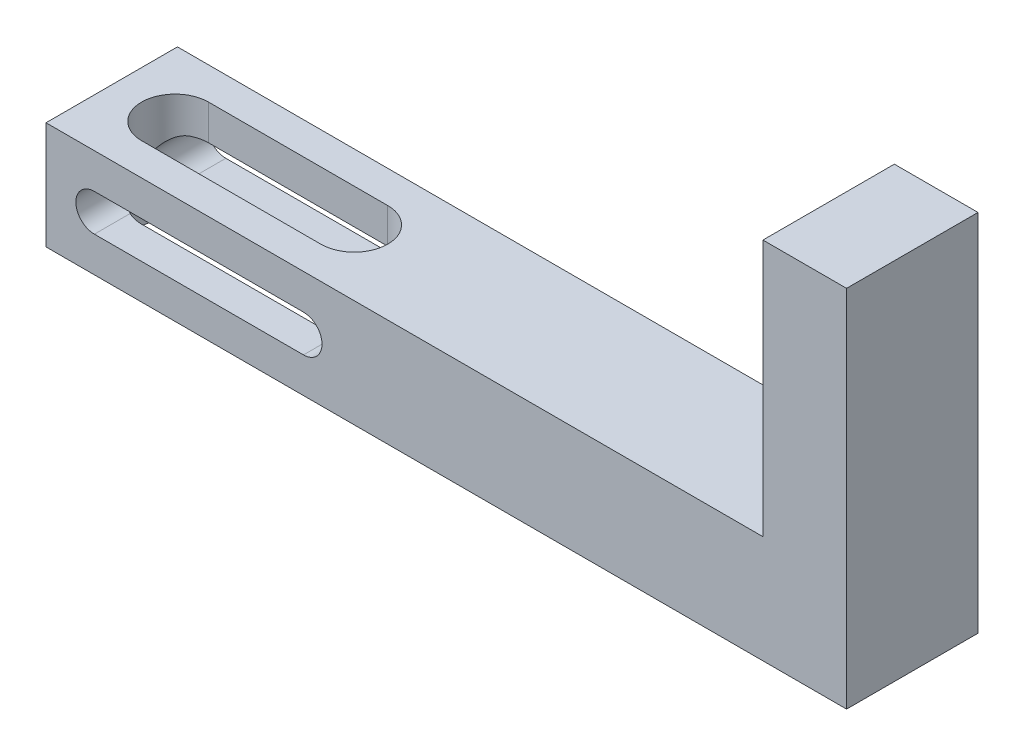
ISO-10303-21;
HEADER;
FILE_DESCRIPTION(('STEP AP214'),'2;1');
FILE_NAME('part.step','',(''),(''),'','','');
FILE_SCHEMA(('AUTOMOTIVE_DESIGN { 1 0 10303 214 1 1 1 1 }'));
ENDSEC;
DATA;
#1=APPLICATION_CONTEXT('core data for automotive mechanical design processes');
#2=APPLICATION_PROTOCOL_DEFINITION('international standard','automotive_design',2000,#1);
#3=PRODUCT_CONTEXT('',#1,'mechanical');
#4=PRODUCT('Part','Part','',(#3));
#5=PRODUCT_RELATED_PRODUCT_CATEGORY('part','',(#4));
#6=PRODUCT_DEFINITION_FORMATION('','',#4);
#7=PRODUCT_DEFINITION_CONTEXT('part definition',#1,'design');
#8=PRODUCT_DEFINITION('design','',#6,#7);
#9=PRODUCT_DEFINITION_SHAPE('','',#8);
#10=(LENGTH_UNIT() NAMED_UNIT(*) SI_UNIT(.MILLI.,.METRE.));
#11=(NAMED_UNIT(*) PLANE_ANGLE_UNIT() SI_UNIT($,.RADIAN.));
#12=(NAMED_UNIT(*) SI_UNIT($,.STERADIAN.) SOLID_ANGLE_UNIT());
#13=UNCERTAINTY_MEASURE_WITH_UNIT(LENGTH_MEASURE(1.E-05),#10,'distance_accuracy_value','');
#14=(GEOMETRIC_REPRESENTATION_CONTEXT(3) GLOBAL_UNCERTAINTY_ASSIGNED_CONTEXT((#13)) GLOBAL_UNIT_ASSIGNED_CONTEXT((#10,
#11,#12)) REPRESENTATION_CONTEXT('',''));
#15=CARTESIAN_POINT('',(0.,0.,0.));
#16=DIRECTION('',(0.,0.,1.));
#17=DIRECTION('',(1.,0.,0.));
#18=AXIS2_PLACEMENT_3D('',#15,#16,#17);
#19=CARTESIAN_POINT('',(5.3,30.5,-5.5));
#20=DIRECTION('',(0.,-1.,0.));
#21=DIRECTION('',(0.,0.,-1.));
#22=AXIS2_PLACEMENT_3D('',#19,#20,#21);
#23=CYLINDRICAL_SURFACE('',#22,2.8);
#24=DIRECTION('',(0.,-1.,0.));
#25=VECTOR('',#24,1.);
#26=CARTESIAN_POINT('',(5.3,30.5,-2.7));
#27=LINE('',#26,#25);
#28=CARTESIAN_POINT('',(5.3,9.00000000000001,-2.7));
#29=VERTEX_POINT('',#28);
#30=CARTESIAN_POINT('',(5.3,6.05,-2.7));
#31=VERTEX_POINT('',#30);
#32=EDGE_CURVE('E280',#29,#31,#27,.T.);
#33=ORIENTED_EDGE('',*,*,#32,.T.);
#34=CARTESIAN_POINT('',(5.3,6.05,-5.5));
#35=DIRECTION('',(0.,1.,0.));
#36=DIRECTION('',(0.,0.,1.));
#37=AXIS2_PLACEMENT_3D('',#34,#35,#36);
#38=CIRCLE('',#37,2.8);
#39=CARTESIAN_POINT('',(4.05,6.05,-2.99450603672649));
#40=VERTEX_POINT('',#39);
#41=EDGE_CURVE('E264',#31,#40,#38,.F.);
#42=ORIENTED_EDGE('',*,*,#41,.T.);
#43=CARTESIAN_POINT('',(4.05,6.05,-2.99450603672649));
#44=CARTESIAN_POINT('',(4.00235849913731,6.05000340639754,-3.01826171536032));
#45=CARTESIAN_POINT('',(3.95543816924829,6.04780450688059,-3.04337946868175));
#46=CARTESIAN_POINT('',(3.8634397763347,6.03942247074209,-3.09602795578411));
#47=CARTESIAN_POINT('',(3.81835871592903,6.03324611635234,-3.12355451323439));
#48=CARTESIAN_POINT('',(3.73072489964936,6.01740812684859,-3.18049942577392));
#49=CARTESIAN_POINT('',(3.6881510048414,6.00778277508583,-3.20989555889612));
#50=CARTESIAN_POINT('',(3.605208038342,5.98543127808409,-3.27057729910489));
#51=CARTESIAN_POINT('',(3.56484017622652,5.97270345222116,-3.30186392334678));
#52=CARTESIAN_POINT('',(3.42475933375882,5.92234509184322,-3.41662665287988));
#53=CARTESIAN_POINT('',(3.33154010018353,5.87702653045519,-3.50481057967421));
#54=CARTESIAN_POINT('',(3.160795126384,5.7735233259298,-3.68899824075137));
#55=CARTESIAN_POINT('',(3.08335403082285,5.71527261948903,-3.78504046793833));
#56=CARTESIAN_POINT('',(2.91569641114651,5.56451907068572,-4.02221169885626));
#57=CARTESIAN_POINT('',(2.83296675232883,5.46768800440536,-4.16587457247137));
#58=CARTESIAN_POINT('',(2.69569649998511,5.26385100249981,-4.4589320450385));
#59=CARTESIAN_POINT('',(2.64116094654124,5.15684325169811,-4.60832766367309));
#60=CARTESIAN_POINT('',(2.56661244256878,4.95921054483475,-4.88009361695275));
#61=CARTESIAN_POINT('',(2.54188977334829,4.86956176589482,-5.00192732743831));
#62=CARTESIAN_POINT('',(2.508790461093,4.68869356353422,-5.24637444852197));
#63=CARTESIAN_POINT('',(2.50038422886213,4.59747728645986,-5.36898604242123));
#64=CARTESIAN_POINT('',(2.50000429530611,4.50421148485537,-5.49433958240073));
#65=CARTESIAN_POINT('',(2.50000000449027,4.5021057217412,-5.4971698183893));
#66=CARTESIAN_POINT('',(2.5,4.5,-5.5));
#67=B_SPLINE_CURVE_WITH_KNOTS('',3,(#43,#44,#45,#46,#47,#48,#49,#50,#51,#52,#53,#54,#55,#56,#57,
#58,#59,#60,#61,#62,#63,#64,#65,#66),.UNSPECIFIED.,.F.,.F.,(4,2,2,2,2,2,2,2,2,2,2,4),(0.,
0.159584782014913,0.318898163000891,0.476582537575669,0.634352521045717,1.04020194633436,
1.44817439937518,2.02103744606059,2.59400286447553,3.05297573278237,3.51111549190942,
3.52169850498702),.UNSPECIFIED.);
#68=CARTESIAN_POINT('',(2.5,4.5,-5.5));
#69=VERTEX_POINT('',#68);
#70=EDGE_CURVE('E11',#40,#69,#67,.T.);
#71=ORIENTED_EDGE('',*,*,#70,.T.);
#72=CARTESIAN_POINT('',(4.05,6.05,-8.00549396327351));
#73=CARTESIAN_POINT('',(4.00235849913731,6.05000340639754,-7.98173828463968));
#74=CARTESIAN_POINT('',(3.95543816924829,6.04780450688059,-7.95662053131825));
#75=CARTESIAN_POINT('',(3.8634397763347,6.03942247074209,-7.90397204421589));
#76=CARTESIAN_POINT('',(3.81835871592903,6.03324611635234,-7.87644548676561));
#77=CARTESIAN_POINT('',(3.73072489964936,6.01740812684859,-7.81950057422607));
#78=CARTESIAN_POINT('',(3.6881510048414,6.00778277508583,-7.79010444110388));
#79=CARTESIAN_POINT('',(3.605208038342,5.98543127808409,-7.72942270089511));
#80=CARTESIAN_POINT('',(3.56484017622652,5.97270345222116,-7.69813607665322));
#81=CARTESIAN_POINT('',(3.42475933375882,5.92234509184322,-7.58337334712012));
#82=CARTESIAN_POINT('',(3.33154010018353,5.87702653045519,-7.49518942032579));
#83=CARTESIAN_POINT('',(3.160795126384,5.7735233259298,-7.31100175924863));
#84=CARTESIAN_POINT('',(3.08335403082285,5.71527261948903,-7.21495953206167));
#85=CARTESIAN_POINT('',(2.91569641114651,5.56451907068572,-6.97778830114374));
#86=CARTESIAN_POINT('',(2.83296675232883,5.46768800440536,-6.83412542752863));
#87=CARTESIAN_POINT('',(2.69569649998511,5.26385100249981,-6.5410679549615));
#88=CARTESIAN_POINT('',(2.64116094654124,5.15684325169811,-6.39167233632691));
#89=CARTESIAN_POINT('',(2.56661244256878,4.95921054483476,-6.11990638304725));
#90=CARTESIAN_POINT('',(2.54188977334829,4.86956176589482,-5.99807267256169));
#91=CARTESIAN_POINT('',(2.50879046109301,4.68869356353422,-5.75362555147803));
#92=CARTESIAN_POINT('',(2.50038422886213,4.59747728645986,-5.63101395757877));
#93=CARTESIAN_POINT('',(2.50000429530611,4.50421148485537,-5.50566041759927));
#94=CARTESIAN_POINT('',(2.50000000449027,4.5021057217412,-5.5028301816107));
#95=CARTESIAN_POINT('',(2.5,4.5,-5.5));
#96=B_SPLINE_CURVE_WITH_KNOTS('',3,(#72,#73,#74,#75,#76,#77,#78,#79,#80,#81,#82,#83,#84,#85,#86,
#87,#88,#89,#90,#91,#92,#93,#94,#95),.UNSPECIFIED.,.F.,.F.,(4,2,2,2,2,2,2,2,2,2,2,4),(0.,
0.159584782014911,0.318898163000891,0.476582537575669,0.634352521045716,1.04020194633436,
1.44817439937518,2.02103744606059,2.59400286447552,3.05297573278237,3.51111549190942,
3.52169850498702),.UNSPECIFIED.);
#97=CARTESIAN_POINT('',(4.05,6.05,-8.00549396327351));
#98=VERTEX_POINT('',#97);
#99=EDGE_CURVE('E61',#69,#98,#96,.F.);
#100=ORIENTED_EDGE('',*,*,#99,.T.);
#101=CARTESIAN_POINT('',(5.3,6.05,-8.3));
#102=VERTEX_POINT('',#101);
#103=EDGE_CURVE('E260',#98,#102,#38,.F.);
#104=ORIENTED_EDGE('',*,*,#103,.T.);
#105=DIRECTION('',(0.,-1.,0.));
#106=VECTOR('',#105,1.);
#107=CARTESIAN_POINT('',(5.3,30.5,-8.3));
#108=LINE('',#107,#106);
#109=CARTESIAN_POINT('',(5.3,9.00000000000001,-8.3));
#110=VERTEX_POINT('',#109);
#111=EDGE_CURVE('E293',#110,#102,#108,.T.);
#112=ORIENTED_EDGE('',*,*,#111,.F.);
#113=CARTESIAN_POINT('',(5.3,9.,-5.5));
#114=DIRECTION('',(0.,1.,0.));
#115=DIRECTION('',(-1.,0.,0.));
#116=AXIS2_PLACEMENT_3D('',#113,#114,#115);
#117=CIRCLE('',#116,2.8);
#118=EDGE_CURVE('E303',#110,#29,#117,.T.);
#119=ORIENTED_EDGE('',*,*,#118,.T.);
#120=EDGE_LOOP('',(#33,#42,#71,#100,#104,#112,#119));
#121=FACE_BOUND('',#120,.T.);
#122=ADVANCED_FACE('F40',(#121),#23,.F.);
#123=CARTESIAN_POINT('',(5.3,30.5,-2.7));
#124=DIRECTION('',(0.,0.,-1.));
#125=DIRECTION('',(-1.,0.,0.));
#126=AXIS2_PLACEMENT_3D('',#123,#124,#125);
#127=PLANE('',#126);
#128=DIRECTION('',(1.,0.,0.));
#129=VECTOR('',#128,1.);
#130=CARTESIAN_POINT('',(5.3,6.05,-2.7));
#131=LINE('',#130,#129);
#132=CARTESIAN_POINT('',(20.3,6.05,-2.7));
#133=VERTEX_POINT('',#132);
#134=EDGE_CURVE('E265',#31,#133,#131,.T.);
#135=ORIENTED_EDGE('',*,*,#134,.F.);
#136=ORIENTED_EDGE('',*,*,#32,.F.);
#137=DIRECTION('',(-1.,0.,0.));
#138=VECTOR('',#137,1.);
#139=CARTESIAN_POINT('',(60.,9.00000000000001,-2.7));
#140=LINE('',#139,#138);
#141=CARTESIAN_POINT('',(20.3,9.00000000000001,-2.7));
#142=VERTEX_POINT('',#141);
#143=EDGE_CURVE('E300',#142,#29,#140,.T.);
#144=ORIENTED_EDGE('',*,*,#143,.F.);
#145=DIRECTION('',(0.,-1.,0.));
#146=VECTOR('',#145,1.);
#147=CARTESIAN_POINT('',(20.3,30.5,-2.7));
#148=LINE('',#147,#146);
#149=EDGE_CURVE('E285',#142,#133,#148,.T.);
#150=ORIENTED_EDGE('',*,*,#149,.T.);
#151=EDGE_LOOP('',(#135,#136,#144,#150));
#152=FACE_BOUND('',#151,.T.);
#153=ADVANCED_FACE('F482',(#152),#127,.T.);
#154=CARTESIAN_POINT('',(20.3,30.5,-5.5));
#155=DIRECTION('',(0.,-1.,0.));
#156=DIRECTION('',(0.,0.,-1.));
#157=AXIS2_PLACEMENT_3D('',#154,#155,#156);
#158=CYLINDRICAL_SURFACE('',#157,2.8);
#159=CARTESIAN_POINT('',(21.55,2.95,-2.99450603672649));
#160=CARTESIAN_POINT('',(21.5976415008627,2.94999659360246,-3.01826171536031));
#161=CARTESIAN_POINT('',(21.6445618307517,2.95219549311941,-3.04337946868173));
#162=CARTESIAN_POINT('',(21.7365602236652,2.9605775292579,-3.09602795578407));
#163=CARTESIAN_POINT('',(21.7816412840709,2.96675388364764,-3.12355451323434));
#164=CARTESIAN_POINT('',(21.8692751003506,2.98259187315139,-3.18049942577387));
#165=CARTESIAN_POINT('',(21.9118489951585,2.99221722491415,-3.20989555889607));
#166=CARTESIAN_POINT('',(21.994791961658,3.0145687219159,-3.27057729910487));
#167=CARTESIAN_POINT('',(22.0351598237735,3.02729654777883,-3.30186392334677));
#168=CARTESIAN_POINT('',(22.1752406662412,3.07765490815679,-3.4166266528799));
#169=CARTESIAN_POINT('',(22.2684598998165,3.12297346954485,-3.50481057967425));
#170=CARTESIAN_POINT('',(22.439204873616,3.22647667407021,-3.68899824075143));
#171=CARTESIAN_POINT('',(22.5166459691772,3.28472738051093,-3.7850404679384));
#172=CARTESIAN_POINT('',(22.6843035888535,3.43548092931433,-4.02221169885617));
#173=CARTESIAN_POINT('',(22.7670332476711,3.53231199559491,-4.16587457247106));
#174=CARTESIAN_POINT('',(22.9043035000149,3.7361489974998,-4.45893204503868));
#175=CARTESIAN_POINT('',(22.9588390534587,3.84315674830062,-4.60832766367398));
#176=CARTESIAN_POINT('',(23.0333875574312,4.04078945516624,-4.88009361695203));
#177=CARTESIAN_POINT('',(23.0581102266517,4.13043823410854,-5.00192732743584));
#178=CARTESIAN_POINT('',(23.091209538907,4.31130643646241,-5.24637444852451));
#179=CARTESIAN_POINT('',(23.0996157711379,4.40252271352768,-5.36898604243051));
#180=CARTESIAN_POINT('',(23.0999957046939,4.49578851514405,-5.49433958240115));
#181=CARTESIAN_POINT('',(23.0999999955097,4.4978942782585,-5.49716981838952));
#182=CARTESIAN_POINT('',(23.1,4.5,-5.5));
#183=B_SPLINE_CURVE_WITH_KNOTS('',3,(#159,#160,#161,#162,#163,#164,#165,#166,#167,#168,#169,
#170,#171,#172,#173,#174,#175,#176,#177,#178,#179,#180,#181,#182),.UNSPECIFIED.,.F.,.F.,(4,2,2,
2,2,2,2,2,2,2,2,4),(0.,0.159584782014847,0.318898163000757,0.476582537575603,0.634352521045716,
1.04020194633446,1.44817439937518,2.02103744606044,2.59400286447553,3.05297573278241,
3.51111549190941,3.52169850498701),.UNSPECIFIED.);
#184=CARTESIAN_POINT('',(21.55,2.95,-2.99450603672649));
#185=VERTEX_POINT('',#184);
#186=CARTESIAN_POINT('',(23.1,4.5,-5.5));
#187=VERTEX_POINT('',#186);
#188=EDGE_CURVE('E359',#185,#187,#183,.T.);
#189=ORIENTED_EDGE('',*,*,#188,.T.);
#190=CARTESIAN_POINT('',(21.55,2.95,-8.00549396327351));
#191=CARTESIAN_POINT('',(21.5976415008627,2.94999659360246,-7.98173828463968));
#192=CARTESIAN_POINT('',(21.6445618307517,2.95219549311941,-7.95662053131827));
#193=CARTESIAN_POINT('',(21.7365602236652,2.9605775292579,-7.90397204421592));
#194=CARTESIAN_POINT('',(21.7816412840709,2.96675388364764,-7.87644548676566));
#195=CARTESIAN_POINT('',(21.8692751003506,2.98259187315139,-7.81950057422613));
#196=CARTESIAN_POINT('',(21.9118489951585,2.99221722491415,-7.79010444110392));
#197=CARTESIAN_POINT('',(21.994791961658,3.0145687219159,-7.72942270089513));
#198=CARTESIAN_POINT('',(22.0351598237735,3.02729654777883,-7.69813607665323));
#199=CARTESIAN_POINT('',(22.1752406662412,3.07765490815679,-7.5833733471201));
#200=CARTESIAN_POINT('',(22.2684598998165,3.12297346954485,-7.49518942032575));
#201=CARTESIAN_POINT('',(22.439204873616,3.22647667407022,-7.31100175924856));
#202=CARTESIAN_POINT('',(22.5166459691772,3.28472738051094,-7.2149595320616));
#203=CARTESIAN_POINT('',(22.6843035888535,3.43548092931433,-6.97778830114381));
#204=CARTESIAN_POINT('',(22.7670332476711,3.53231199559491,-6.83412542752892));
#205=CARTESIAN_POINT('',(22.9043035000149,3.73614899749982,-6.54106795496132));
#206=CARTESIAN_POINT('',(22.9588390534588,3.84315674830068,-6.39167233632604));
#207=CARTESIAN_POINT('',(23.0333875574312,4.0407894551662,-6.11990638304792));
#208=CARTESIAN_POINT('',(23.0581102266517,4.13043823410842,-5.99807267256405));
#209=CARTESIAN_POINT('',(23.091209538907,4.31130643646255,-5.75362555147559));
#210=CARTESIAN_POINT('',(23.0996157711379,4.40252271352818,-5.63101395756986));
#211=CARTESIAN_POINT('',(23.0999957046939,4.49578851514408,-5.50566041759886));
#212=CARTESIAN_POINT('',(23.0999999955097,4.49789427825852,-5.50283018161049));
#213=CARTESIAN_POINT('',(23.1,4.5,-5.5));
#214=B_SPLINE_CURVE_WITH_KNOTS('',3,(#190,#191,#192,#193,#194,#195,#196,#197,#198,#199,#200,
#201,#202,#203,#204,#205,#206,#207,#208,#209,#210,#211,#212,#213),.UNSPECIFIED.,.F.,.F.,(4,2,2,
2,2,2,2,2,2,2,2,4),(0.,0.159584782014851,0.318898163000768,0.476582537575606,0.634352521045719,
1.04020194633446,1.44817439937519,2.02103744606046,2.59400286447555,3.05297573278241,
3.51111549190941,3.52169850498701),.UNSPECIFIED.);
#215=CARTESIAN_POINT('',(21.55,2.95,-8.00549396327351));
#216=VERTEX_POINT('',#215);
#217=EDGE_CURVE('E391',#187,#216,#214,.F.);
#218=ORIENTED_EDGE('',*,*,#217,.T.);
#219=CARTESIAN_POINT('',(20.3,2.95,-5.5));
#220=DIRECTION('',(0.,-1.,0.));
#221=DIRECTION('',(0.,0.,-1.));
#222=AXIS2_PLACEMENT_3D('',#219,#220,#221);
#223=CIRCLE('',#222,2.8);
#224=CARTESIAN_POINT('',(20.3,2.95,-8.3));
#225=VERTEX_POINT('',#224);
#226=EDGE_CURVE('E242',#216,#225,#223,.F.);
#227=ORIENTED_EDGE('',*,*,#226,.T.);
#228=DIRECTION('',(0.,-1.,0.));
#229=VECTOR('',#228,1.);
#230=CARTESIAN_POINT('',(20.3,30.5,-8.3));
#231=LINE('',#230,#229);
#232=CARTESIAN_POINT('',(20.3,0.,-8.3));
#233=VERTEX_POINT('',#232);
#234=EDGE_CURVE('E292',#225,#233,#231,.T.);
#235=ORIENTED_EDGE('',*,*,#234,.T.);
#236=CARTESIAN_POINT('',(20.3,0.,-5.5));
#237=DIRECTION('',(0.,-1.,0.));
#238=DIRECTION('',(0.,0.,-1.));
#239=AXIS2_PLACEMENT_3D('',#236,#237,#238);
#240=CIRCLE('',#239,2.8);
#241=CARTESIAN_POINT('',(20.3,0.,-2.7));
#242=VERTEX_POINT('',#241);
#243=EDGE_CURVE('E273',#233,#242,#240,.T.);
#244=ORIENTED_EDGE('',*,*,#243,.T.);
#245=CARTESIAN_POINT('',(20.3,2.95,-2.7));
#246=VERTEX_POINT('',#245);
#247=EDGE_CURVE('E288',#246,#242,#148,.T.);
#248=ORIENTED_EDGE('',*,*,#247,.F.);
#249=EDGE_CURVE('E252',#246,#185,#223,.F.);
#250=ORIENTED_EDGE('',*,*,#249,.T.);
#251=EDGE_LOOP('',(#189,#218,#227,#235,#244,#248,#250));
#252=FACE_BOUND('',#251,.T.);
#253=ADVANCED_FACE('F465',(#252),#158,.F.);
#254=CARTESIAN_POINT('',(5.3,30.5,-8.3));
#255=DIRECTION('',(0.,0.,-1.));
#256=DIRECTION('',(-1.,0.,0.));
#257=AXIS2_PLACEMENT_3D('',#254,#255,#256);
#258=PLANE('',#257);
#259=ORIENTED_EDGE('',*,*,#111,.T.);
#260=DIRECTION('',(1.,0.,0.));
#261=VECTOR('',#260,1.);
#262=CARTESIAN_POINT('',(5.3,6.05,-8.3));
#263=LINE('',#262,#261);
#264=CARTESIAN_POINT('',(20.3,6.05000000000001,-8.3));
#265=VERTEX_POINT('',#264);
#266=EDGE_CURVE('E356',#102,#265,#263,.T.);
#267=ORIENTED_EDGE('',*,*,#266,.T.);
#268=CARTESIAN_POINT('',(20.3,9.,-8.3));
#269=VERTEX_POINT('',#268);
#270=EDGE_CURVE('E289',#269,#265,#231,.T.);
#271=ORIENTED_EDGE('',*,*,#270,.F.);
#272=DIRECTION('',(-1.,0.,0.));
#273=VECTOR('',#272,1.);
#274=CARTESIAN_POINT('',(60.,9.00000000000001,-8.3));
#275=LINE('',#274,#273);
#276=EDGE_CURVE('E283',#269,#110,#275,.T.);
#277=ORIENTED_EDGE('',*,*,#276,.T.);
#278=EDGE_LOOP('',(#259,#267,#271,#277));
#279=FACE_BOUND('',#278,.T.);
#280=ADVANCED_FACE('F475',(#279),#258,.F.);
#281=CARTESIAN_POINT('',(0.,9.,-11.));
#282=DIRECTION('',(-1.,0.,0.));
#283=DIRECTION('',(0.,-1.,0.));
#284=AXIS2_PLACEMENT_3D('',#281,#282,#283);
#285=PLANE('',#284);
#286=DIRECTION('',(0.,-1.,0.));
#287=VECTOR('',#286,1.);
#288=CARTESIAN_POINT('',(0.,9.,0.));
#289=LINE('',#288,#287);
#290=CARTESIAN_POINT('',(0.,9.,0.));
#291=VERTEX_POINT('',#290);
#292=CARTESIAN_POINT('',(0.,0.,0.));
#293=VERTEX_POINT('',#292);
#294=EDGE_CURVE('E305',#291,#293,#289,.T.);
#295=ORIENTED_EDGE('',*,*,#294,.F.);
#296=DIRECTION('',(0.,0.,1.));
#297=VECTOR('',#296,1.);
#298=CARTESIAN_POINT('',(0.,9.,-11.));
#299=LINE('',#298,#297);
#300=CARTESIAN_POINT('',(0.,9.,-11.));
#301=VERTEX_POINT('',#300);
#302=EDGE_CURVE('E342',#301,#291,#299,.T.);
#303=ORIENTED_EDGE('',*,*,#302,.F.);
#304=DIRECTION('',(0.,-1.,0.));
#305=VECTOR('',#304,1.);
#306=CARTESIAN_POINT('',(0.,9.,-11.));
#307=LINE('',#306,#305);
#308=CARTESIAN_POINT('',(0.,0.,-11.));
#309=VERTEX_POINT('',#308);
#310=EDGE_CURVE('E306',#301,#309,#307,.T.);
#311=ORIENTED_EDGE('',*,*,#310,.T.);
#312=DIRECTION('',(0.,0.,1.));
#313=VECTOR('',#312,1.);
#314=CARTESIAN_POINT('',(0.,0.,-11.));
#315=LINE('',#314,#313);
#316=EDGE_CURVE('E325',#309,#293,#315,.T.);
#317=ORIENTED_EDGE('',*,*,#316,.T.);
#318=EDGE_LOOP('',(#295,#303,#311,#317));
#319=FACE_BOUND('',#318,.T.);
#320=ADVANCED_FACE('F42',(#319),#285,.T.);
#321=CARTESIAN_POINT('',(60.,9.00000000000001,-11.));
#322=DIRECTION('',(0.,1.,0.));
#323=DIRECTION('',(-1.,0.,0.));
#324=AXIS2_PLACEMENT_3D('',#321,#322,#323);
#325=PLANE('',#324);
#326=ORIENTED_EDGE('',*,*,#118,.F.);
#327=ORIENTED_EDGE('',*,*,#276,.F.);
#328=CARTESIAN_POINT('',(20.3,9.00000000000001,-5.5));
#329=DIRECTION('',(0.,1.,0.));
#330=DIRECTION('',(-1.,0.,0.));
#331=AXIS2_PLACEMENT_3D('',#328,#329,#330);
#332=CIRCLE('',#331,2.8);
#333=EDGE_CURVE('E297',#142,#269,#332,.T.);
#334=ORIENTED_EDGE('',*,*,#333,.F.);
#335=ORIENTED_EDGE('',*,*,#143,.T.);
#336=EDGE_LOOP('',(#326,#327,#334,#335));
#337=FACE_BOUND('',#336,.T.);
#338=DIRECTION('',(-1.,0.,0.));
#339=VECTOR('',#338,1.);
#340=CARTESIAN_POINT('',(60.,9.00000000000001,0.));
#341=LINE('',#340,#339);
#342=CARTESIAN_POINT('',(60.,9.00000000000001,0.));
#343=VERTEX_POINT('',#342);
#344=EDGE_CURVE('E310',#343,#291,#341,.T.);
#345=ORIENTED_EDGE('',*,*,#344,.F.);
#346=DIRECTION('',(0.,0.,1.));
#347=VECTOR('',#346,1.);
#348=CARTESIAN_POINT('',(60.,9.00000000000001,-11.));
#349=LINE('',#348,#347);
#350=CARTESIAN_POINT('',(60.,9.00000000000001,-11.));
#351=VERTEX_POINT('',#350);
#352=EDGE_CURVE('E345',#351,#343,#349,.T.);
#353=ORIENTED_EDGE('',*,*,#352,.F.);
#354=DIRECTION('',(-1.,0.,0.));
#355=VECTOR('',#354,1.);
#356=CARTESIAN_POINT('',(60.,9.00000000000001,-11.));
#357=LINE('',#356,#355);
#358=EDGE_CURVE('E322',#351,#301,#357,.T.);
#359=ORIENTED_EDGE('',*,*,#358,.T.);
#360=ORIENTED_EDGE('',*,*,#302,.T.);
#361=EDGE_LOOP('',(#345,#353,#359,#360));
#362=FACE_BOUND('',#361,.T.);
#363=ADVANCED_FACE('F479',(#337,#362),#325,.T.);
#364=CARTESIAN_POINT('',(60.,30.5,-11.));
#365=DIRECTION('',(-1.,0.,0.));
#366=DIRECTION('',(0.,-1.,0.));
#367=AXIS2_PLACEMENT_3D('',#364,#365,#366);
#368=PLANE('',#367);
#369=DIRECTION('',(0.,-1.,0.));
#370=VECTOR('',#369,1.);
#371=CARTESIAN_POINT('',(60.,30.5,0.));
#372=LINE('',#371,#370);
#373=CARTESIAN_POINT('',(60.,30.5,0.));
#374=VERTEX_POINT('',#373);
#375=EDGE_CURVE('E337',#374,#343,#372,.T.);
#376=ORIENTED_EDGE('',*,*,#375,.F.);
#377=DIRECTION('',(0.,0.,1.));
#378=VECTOR('',#377,1.);
#379=CARTESIAN_POINT('',(60.,30.5,-11.));
#380=LINE('',#379,#378);
#381=CARTESIAN_POINT('',(60.,30.5,-11.));
#382=VERTEX_POINT('',#381);
#383=EDGE_CURVE('E347',#382,#374,#380,.T.);
#384=ORIENTED_EDGE('',*,*,#383,.F.);
#385=DIRECTION('',(0.,-1.,0.));
#386=VECTOR('',#385,1.);
#387=CARTESIAN_POINT('',(60.,30.5,-11.));
#388=LINE('',#387,#386);
#389=EDGE_CURVE('E319',#382,#351,#388,.T.);
#390=ORIENTED_EDGE('',*,*,#389,.T.);
#391=ORIENTED_EDGE('',*,*,#352,.T.);
#392=EDGE_LOOP('',(#376,#384,#390,#391));
#393=FACE_BOUND('',#392,.T.);
#394=ADVANCED_FACE('F506',(#393),#368,.T.);
#395=CARTESIAN_POINT('',(67.,30.5,-11.));
#396=DIRECTION('',(0.,1.,0.));
#397=DIRECTION('',(-1.,0.,0.));
#398=AXIS2_PLACEMENT_3D('',#395,#396,#397);
#399=PLANE('',#398);
#400=DIRECTION('',(-1.,0.,0.));
#401=VECTOR('',#400,1.);
#402=CARTESIAN_POINT('',(67.,30.5,0.));
#403=LINE('',#402,#401);
#404=CARTESIAN_POINT('',(67.,30.5,0.));
#405=VERTEX_POINT('',#404);
#406=EDGE_CURVE('E334',#405,#374,#403,.T.);
#407=ORIENTED_EDGE('',*,*,#406,.F.);
#408=DIRECTION('',(0.,0.,1.));
#409=VECTOR('',#408,1.);
#410=CARTESIAN_POINT('',(67.,30.5,-11.));
#411=LINE('',#410,#409);
#412=CARTESIAN_POINT('',(67.,30.5,-11.));
#413=VERTEX_POINT('',#412);
#414=EDGE_CURVE('E349',#413,#405,#411,.T.);
#415=ORIENTED_EDGE('',*,*,#414,.F.);
#416=DIRECTION('',(-1.,0.,0.));
#417=VECTOR('',#416,1.);
#418=CARTESIAN_POINT('',(67.,30.5,-11.));
#419=LINE('',#418,#417);
#420=EDGE_CURVE('E316',#413,#382,#419,.T.);
#421=ORIENTED_EDGE('',*,*,#420,.T.);
#422=ORIENTED_EDGE('',*,*,#383,.T.);
#423=EDGE_LOOP('',(#407,#415,#421,#422));
#424=FACE_BOUND('',#423,.T.);
#425=ADVANCED_FACE('F509',(#424),#399,.T.);
#426=CARTESIAN_POINT('',(67.,0.,-11.));
#427=DIRECTION('',(1.,0.,0.));
#428=DIRECTION('',(0.,0.,-1.));
#429=AXIS2_PLACEMENT_3D('',#426,#427,#428);
#430=PLANE('',#429);
#431=DIRECTION('',(0.,1.,0.));
#432=VECTOR('',#431,1.);
#433=CARTESIAN_POINT('',(67.,0.,0.));
#434=LINE('',#433,#432);
#435=CARTESIAN_POINT('',(67.,0.,0.));
#436=VERTEX_POINT('',#435);
#437=EDGE_CURVE('E331',#436,#405,#434,.T.);
#438=ORIENTED_EDGE('',*,*,#437,.F.);
#439=DIRECTION('',(0.,0.,1.));
#440=VECTOR('',#439,1.);
#441=CARTESIAN_POINT('',(67.,0.,-11.));
#442=LINE('',#441,#440);
#443=CARTESIAN_POINT('',(67.,0.,-11.));
#444=VERTEX_POINT('',#443);
#445=EDGE_CURVE('E351',#444,#436,#442,.T.);
#446=ORIENTED_EDGE('',*,*,#445,.F.);
#447=DIRECTION('',(0.,1.,0.));
#448=VECTOR('',#447,1.);
#449=CARTESIAN_POINT('',(67.,0.,-11.));
#450=LINE('',#449,#448);
#451=EDGE_CURVE('E313',#444,#413,#450,.T.);
#452=ORIENTED_EDGE('',*,*,#451,.T.);
#453=ORIENTED_EDGE('',*,*,#414,.T.);
#454=EDGE_LOOP('',(#438,#446,#452,#453));
#455=FACE_BOUND('',#454,.T.);
#456=ADVANCED_FACE('F513',(#455),#430,.T.);
#457=CARTESIAN_POINT('',(0.,0.,-11.));
#458=DIRECTION('',(0.,-1.,0.));
#459=DIRECTION('',(0.,0.,-1.));
#460=AXIS2_PLACEMENT_3D('',#457,#458,#459);
#461=PLANE('',#460);
#462=CARTESIAN_POINT('',(5.3,0.,-5.5));
#463=DIRECTION('',(0.,-1.,0.));
#464=DIRECTION('',(0.,0.,-1.));
#465=AXIS2_PLACEMENT_3D('',#462,#463,#464);
#466=CIRCLE('',#465,2.8);
#467=CARTESIAN_POINT('',(5.3,0.,-2.7));
#468=VERTEX_POINT('',#467);
#469=CARTESIAN_POINT('',(5.3,0.,-8.3));
#470=VERTEX_POINT('',#469);
#471=EDGE_CURVE('E267',#468,#470,#466,.T.);
#472=ORIENTED_EDGE('',*,*,#471,.F.);
#473=DIRECTION('',(1.,0.,0.));
#474=VECTOR('',#473,1.);
#475=CARTESIAN_POINT('',(5.3,0.,-2.7));
#476=LINE('',#475,#474);
#477=EDGE_CURVE('E276',#468,#242,#476,.T.);
#478=ORIENTED_EDGE('',*,*,#477,.T.);
#479=ORIENTED_EDGE('',*,*,#243,.F.);
#480=DIRECTION('',(1.,0.,0.));
#481=VECTOR('',#480,1.);
#482=CARTESIAN_POINT('',(5.3,0.,-8.3));
#483=LINE('',#482,#481);
#484=EDGE_CURVE('E270',#470,#233,#483,.T.);
#485=ORIENTED_EDGE('',*,*,#484,.F.);
#486=EDGE_LOOP('',(#472,#478,#479,#485));
#487=FACE_BOUND('',#486,.T.);
#488=DIRECTION('',(1.,0.,0.));
#489=VECTOR('',#488,1.);
#490=CARTESIAN_POINT('',(0.,0.,0.));
#491=LINE('',#490,#489);
#492=EDGE_CURVE('E328',#293,#436,#491,.T.);
#493=ORIENTED_EDGE('',*,*,#492,.F.);
#494=ORIENTED_EDGE('',*,*,#316,.F.);
#495=DIRECTION('',(1.,0.,0.));
#496=VECTOR('',#495,1.);
#497=CARTESIAN_POINT('',(0.,0.,-11.));
#498=LINE('',#497,#496);
#499=EDGE_CURVE('E309',#309,#444,#498,.T.);
#500=ORIENTED_EDGE('',*,*,#499,.T.);
#501=ORIENTED_EDGE('',*,*,#445,.T.);
#502=EDGE_LOOP('',(#493,#494,#500,#501));
#503=FACE_BOUND('',#502,.T.);
#504=ADVANCED_FACE('F458',(#487,#503),#461,.T.);
#505=CARTESIAN_POINT('',(0.,0.,-11.));
#506=DIRECTION('',(0.,0.,1.));
#507=DIRECTION('',(1.,0.,0.));
#508=AXIS2_PLACEMENT_3D('',#505,#506,#507);
#509=PLANE('',#508);
#510=DIRECTION('',(-1.,0.,0.));
#511=VECTOR('',#510,1.);
#512=CARTESIAN_POINT('',(4.05,6.05,-11.));
#513=LINE('',#512,#511);
#514=CARTESIAN_POINT('',(21.55,6.05,-11.));
#515=VERTEX_POINT('',#514);
#516=CARTESIAN_POINT('',(4.05,6.05,-11.));
#517=VERTEX_POINT('',#516);
#518=EDGE_CURVE('E224',#515,#517,#513,.T.);
#519=ORIENTED_EDGE('',*,*,#518,.T.);
#520=CARTESIAN_POINT('',(4.05,4.5,-11.));
#521=DIRECTION('',(0.,0.,1.));
#522=DIRECTION('',(1.,0.,0.));
#523=AXIS2_PLACEMENT_3D('',#520,#521,#522);
#524=CIRCLE('',#523,1.55);
#525=CARTESIAN_POINT('',(4.05,2.95,-11.));
#526=VERTEX_POINT('',#525);
#527=EDGE_CURVE('E206',#517,#526,#524,.T.);
#528=ORIENTED_EDGE('',*,*,#527,.T.);
#529=DIRECTION('',(1.,0.,0.));
#530=VECTOR('',#529,1.);
#531=CARTESIAN_POINT('',(4.05,2.95,-11.));
#532=LINE('',#531,#530);
#533=CARTESIAN_POINT('',(21.55,2.95,-11.));
#534=VERTEX_POINT('',#533);
#535=EDGE_CURVE('E216',#526,#534,#532,.T.);
#536=ORIENTED_EDGE('',*,*,#535,.T.);
#537=CARTESIAN_POINT('',(21.55,4.5,-11.));
#538=DIRECTION('',(0.,0.,1.));
#539=DIRECTION('',(1.,0.,0.));
#540=AXIS2_PLACEMENT_3D('',#537,#538,#539);
#541=CIRCLE('',#540,1.55);
#542=EDGE_CURVE('E69',#534,#515,#541,.T.);
#543=ORIENTED_EDGE('',*,*,#542,.T.);
#544=EDGE_LOOP('',(#519,#528,#536,#543));
#545=FACE_BOUND('',#544,.T.);
#546=ORIENTED_EDGE('',*,*,#310,.F.);
#547=ORIENTED_EDGE('',*,*,#358,.F.);
#548=ORIENTED_EDGE('',*,*,#389,.F.);
#549=ORIENTED_EDGE('',*,*,#420,.F.);
#550=ORIENTED_EDGE('',*,*,#451,.F.);
#551=ORIENTED_EDGE('',*,*,#499,.F.);
#552=EDGE_LOOP('',(#546,#547,#548,#549,#550,#551));
#553=FACE_BOUND('',#552,.T.);
#554=ADVANCED_FACE('F221',(#545,#553),#509,.F.);
#555=CARTESIAN_POINT('',(0.,0.,0.));
#556=DIRECTION('',(0.,0.,1.));
#557=DIRECTION('',(1.,0.,0.));
#558=AXIS2_PLACEMENT_3D('',#555,#556,#557);
#559=PLANE('',#558);
#560=CARTESIAN_POINT('',(4.05,4.5,0.));
#561=DIRECTION('',(0.,0.,1.));
#562=DIRECTION('',(1.,0.,0.));
#563=AXIS2_PLACEMENT_3D('',#560,#561,#562);
#564=CIRCLE('',#563,1.55);
#565=CARTESIAN_POINT('',(4.05,6.05,0.));
#566=VERTEX_POINT('',#565);
#567=CARTESIAN_POINT('',(4.05,2.95,0.));
#568=VERTEX_POINT('',#567);
#569=EDGE_CURVE('E233',#566,#568,#564,.T.);
#570=ORIENTED_EDGE('',*,*,#569,.F.);
#571=DIRECTION('',(-1.,0.,0.));
#572=VECTOR('',#571,1.);
#573=CARTESIAN_POINT('',(4.05,6.05,0.));
#574=LINE('',#573,#572);
#575=CARTESIAN_POINT('',(21.55,6.05,0.));
#576=VERTEX_POINT('',#575);
#577=EDGE_CURVE('E225',#576,#566,#574,.T.);
#578=ORIENTED_EDGE('',*,*,#577,.F.);
#579=CARTESIAN_POINT('',(21.55,4.5,0.));
#580=DIRECTION('',(0.,0.,1.));
#581=DIRECTION('',(1.,0.,0.));
#582=AXIS2_PLACEMENT_3D('',#579,#580,#581);
#583=CIRCLE('',#582,1.55);
#584=CARTESIAN_POINT('',(21.55,2.95,0.));
#585=VERTEX_POINT('',#584);
#586=EDGE_CURVE('E228',#585,#576,#583,.T.);
#587=ORIENTED_EDGE('',*,*,#586,.F.);
#588=DIRECTION('',(1.,0.,0.));
#589=VECTOR('',#588,1.);
#590=CARTESIAN_POINT('',(4.05,2.95,0.));
#591=LINE('',#590,#589);
#592=EDGE_CURVE('E235',#568,#585,#591,.T.);
#593=ORIENTED_EDGE('',*,*,#592,.F.);
#594=EDGE_LOOP('',(#570,#578,#587,#593));
#595=FACE_BOUND('',#594,.T.);
#596=ORIENTED_EDGE('',*,*,#294,.T.);
#597=ORIENTED_EDGE('',*,*,#492,.T.);
#598=ORIENTED_EDGE('',*,*,#437,.T.);
#599=ORIENTED_EDGE('',*,*,#406,.T.);
#600=ORIENTED_EDGE('',*,*,#375,.T.);
#601=ORIENTED_EDGE('',*,*,#344,.T.);
#602=EDGE_LOOP('',(#596,#597,#598,#599,#600,#601));
#603=FACE_BOUND('',#602,.T.);
#604=ADVANCED_FACE('F444',(#595,#603),#559,.T.);
#605=CARTESIAN_POINT('',(4.05,2.95,-8.00549396327351));
#606=CARTESIAN_POINT('',(4.00235849913731,2.94999659360246,-7.98173828463968));
#607=CARTESIAN_POINT('',(3.95543816924829,2.95219549311941,-7.95662053131825));
#608=CARTESIAN_POINT('',(3.8634397763347,2.96057752925791,-7.90397204421588));
#609=CARTESIAN_POINT('',(3.81835871592903,2.96675388364766,-7.87644548676561));
#610=CARTESIAN_POINT('',(3.73072489964936,2.98259187315141,-7.81950057422607));
#611=CARTESIAN_POINT('',(3.68815100484139,2.99221722491417,-7.79010444110388));
#612=CARTESIAN_POINT('',(3.60520803834199,3.01456872191591,-7.72942270089511));
#613=CARTESIAN_POINT('',(3.56484017622651,3.02729654777884,-7.69813607665322));
#614=CARTESIAN_POINT('',(3.42475933375882,3.07765490815678,-7.58337334712012));
#615=CARTESIAN_POINT('',(3.33154010018353,3.12297346954481,-7.49518942032579));
#616=CARTESIAN_POINT('',(3.16079512638399,3.2264766740702,-7.31100175924863));
#617=CARTESIAN_POINT('',(3.08335403082285,3.28472738051097,-7.21495953206167));
#618=CARTESIAN_POINT('',(2.91569641114651,3.43548092931428,-6.97778830114373));
#619=CARTESIAN_POINT('',(2.83296675232883,3.53231199559463,-6.83412542752861));
#620=CARTESIAN_POINT('',(2.69569649998511,3.7361489975002,-6.5410679549615));
#621=CARTESIAN_POINT('',(2.64116094654124,3.84315674830192,-6.39167233632692));
#622=CARTESIAN_POINT('',(2.56661244256878,4.04078945516523,-6.11990638304723));
#623=CARTESIAN_POINT('',(2.54188977334829,4.1304382341051,-5.99807267256164));
#624=CARTESIAN_POINT('',(2.50879046109301,4.31130643646585,-5.75362555147808));
#625=CARTESIAN_POINT('',(2.50038422886213,4.4025227135404,-5.63101395757896));
#626=CARTESIAN_POINT('',(2.50000429530611,4.49578851514463,-5.50566041759928));
#627=CARTESIAN_POINT('',(2.50000000449027,4.4978942782588,-5.5028301816107));
#628=CARTESIAN_POINT('',(2.5,4.5,-5.5));
#629=B_SPLINE_CURVE_WITH_KNOTS('',3,(#605,#606,#607,#608,#609,#610,#611,#612,#613,#614,#615,
#616,#617,#618,#619,#620,#621,#622,#623,#624,#625,#626,#627,#628),.UNSPECIFIED.,.F.,.F.,(4,2,2,
2,2,2,2,2,2,2,2,4),(0.,0.159584782014914,0.318898163000894,0.47658253757567,0.634352521045717,
1.04020194633436,1.44817439937519,2.0210374460606,2.59400286447553,3.05297573278237,
3.51111549190942,3.52169850498702),.UNSPECIFIED.);
#630=CARTESIAN_POINT('',(4.05,2.95,-8.00549396327351));
#631=VERTEX_POINT('',#630);
#632=EDGE_CURVE('E209',#631,#69,#629,.T.);
#633=ORIENTED_EDGE('',*,*,#632,.T.);
#634=CARTESIAN_POINT('',(4.05,2.95,-2.99450603672649));
#635=CARTESIAN_POINT('',(4.00235849913731,2.94999659360246,-3.01826171536032));
#636=CARTESIAN_POINT('',(3.95543816924829,2.95219549311941,-3.04337946868175));
#637=CARTESIAN_POINT('',(3.8634397763347,2.96057752925791,-3.09602795578412));
#638=CARTESIAN_POINT('',(3.81835871592903,2.96675388364766,-3.12355451323439));
#639=CARTESIAN_POINT('',(3.73072489964935,2.98259187315141,-3.18049942577393));
#640=CARTESIAN_POINT('',(3.68815100484139,2.99221722491417,-3.20989555889612));
#641=CARTESIAN_POINT('',(3.60520803834199,3.01456872191591,-3.27057729910489));
#642=CARTESIAN_POINT('',(3.56484017622651,3.02729654777884,-3.30186392334678));
#643=CARTESIAN_POINT('',(3.42475933375882,3.07765490815678,-3.41662665287988));
#644=CARTESIAN_POINT('',(3.33154010018353,3.12297346954481,-3.50481057967421));
#645=CARTESIAN_POINT('',(3.160795126384,3.2264766740702,-3.68899824075137));
#646=CARTESIAN_POINT('',(3.08335403082285,3.28472738051097,-3.78504046793833));
#647=CARTESIAN_POINT('',(2.91569641114651,3.43548092931428,-4.02221169885627));
#648=CARTESIAN_POINT('',(2.83296675232883,3.53231199559463,-4.16587457247139));
#649=CARTESIAN_POINT('',(2.69569649998511,3.7361489975002,-4.4589320450385));
#650=CARTESIAN_POINT('',(2.64116094654124,3.84315674830192,-4.60832766367307));
#651=CARTESIAN_POINT('',(2.56661244256878,4.04078945516522,-4.88009361695277));
#652=CARTESIAN_POINT('',(2.54188977334829,4.1304382341051,-5.00192732743837));
#653=CARTESIAN_POINT('',(2.50879046109301,4.31130643646586,-5.24637444852191));
#654=CARTESIAN_POINT('',(2.50038422886213,4.40252271354043,-5.36898604242101));
#655=CARTESIAN_POINT('',(2.50000429530611,4.49578851514464,-5.49433958240072));
#656=CARTESIAN_POINT('',(2.50000000449027,4.4978942782588,-5.49716981838929));
#657=CARTESIAN_POINT('',(2.5,4.5,-5.5));
#658=B_SPLINE_CURVE_WITH_KNOTS('',3,(#634,#635,#636,#637,#638,#639,#640,#641,#642,#643,#644,
#645,#646,#647,#648,#649,#650,#651,#652,#653,#654,#655,#656,#657),.UNSPECIFIED.,.F.,.F.,(4,2,2,
2,2,2,2,2,2,2,2,4),(0.,0.159584782014915,0.318898163000896,0.476582537575671,0.634352521045718,
1.04020194633436,1.44817439937519,2.0210374460606,2.59400286447553,3.05297573278237,
3.51111549190942,3.52169850498702),.UNSPECIFIED.);
#659=CARTESIAN_POINT('',(4.05,2.95,-2.99450603672649));
#660=VERTEX_POINT('',#659);
#661=EDGE_CURVE('E54',#69,#660,#658,.F.);
#662=ORIENTED_EDGE('',*,*,#661,.T.);
#663=CARTESIAN_POINT('',(5.3,2.95,-5.5));
#664=DIRECTION('',(0.,-1.,0.));
#665=DIRECTION('',(0.,0.,-1.));
#666=AXIS2_PLACEMENT_3D('',#663,#664,#665);
#667=CIRCLE('',#666,2.8);
#668=CARTESIAN_POINT('',(5.3,2.95,-2.7));
#669=VERTEX_POINT('',#668);
#670=EDGE_CURVE('E254',#660,#669,#667,.F.);
#671=ORIENTED_EDGE('',*,*,#670,.T.);
#672=EDGE_CURVE('E284',#669,#468,#27,.T.);
#673=ORIENTED_EDGE('',*,*,#672,.T.);
#674=ORIENTED_EDGE('',*,*,#471,.T.);
#675=CARTESIAN_POINT('',(5.3,2.95000000000001,-8.3));
#676=VERTEX_POINT('',#675);
#677=EDGE_CURVE('E279',#676,#470,#108,.T.);
#678=ORIENTED_EDGE('',*,*,#677,.F.);
#679=EDGE_CURVE('E251',#676,#631,#667,.F.);
#680=ORIENTED_EDGE('',*,*,#679,.T.);
#681=EDGE_LOOP('',(#633,#662,#671,#673,#674,#678,#680));
#682=FACE_BOUND('',#681,.T.);
#683=ADVANCED_FACE('F413',(#682),#23,.F.);
#684=DIRECTION('',(-1.,0.,0.));
#685=VECTOR('',#684,1.);
#686=CARTESIAN_POINT('',(5.3,2.95,-2.7));
#687=LINE('',#686,#685);
#688=EDGE_CURVE('E255',#246,#669,#687,.T.);
#689=ORIENTED_EDGE('',*,*,#688,.F.);
#690=ORIENTED_EDGE('',*,*,#247,.T.);
#691=ORIENTED_EDGE('',*,*,#477,.F.);
#692=ORIENTED_EDGE('',*,*,#672,.F.);
#693=EDGE_LOOP('',(#689,#690,#691,#692));
#694=FACE_BOUND('',#693,.T.);
#695=ADVANCED_FACE('F419',(#694),#127,.T.);
#696=CARTESIAN_POINT('',(21.55,6.05,-2.99450603672649));
#697=CARTESIAN_POINT('',(21.5976415008627,6.05000340639754,-3.01826171536031));
#698=CARTESIAN_POINT('',(21.6445618307517,6.04780450688059,-3.04337946868173));
#699=CARTESIAN_POINT('',(21.7365602236652,6.0394224707421,-3.09602795578407));
#700=CARTESIAN_POINT('',(21.7816412840709,6.03324611635236,-3.12355451323434));
#701=CARTESIAN_POINT('',(21.8692751003506,6.01740812684861,-3.18049942577387));
#702=CARTESIAN_POINT('',(21.9118489951585,6.00778277508585,-3.20989555889608));
#703=CARTESIAN_POINT('',(21.994791961658,5.9854312780841,-3.27057729910487));
#704=CARTESIAN_POINT('',(22.0351598237735,5.97270345222117,-3.30186392334677));
#705=CARTESIAN_POINT('',(22.1752406662412,5.92234509184321,-3.4166266528799));
#706=CARTESIAN_POINT('',(22.2684598998165,5.87702653045515,-3.50481057967425));
#707=CARTESIAN_POINT('',(22.439204873616,5.77352332592979,-3.68899824075143));
#708=CARTESIAN_POINT('',(22.5166459691772,5.71527261948906,-3.7850404679384));
#709=CARTESIAN_POINT('',(22.6843035888535,5.56451907068567,-4.02221169885618));
#710=CARTESIAN_POINT('',(22.7670332476711,5.46768800440509,-4.16587457247107));
#711=CARTESIAN_POINT('',(22.9043035000149,5.26385100250019,-4.45893204503868));
#712=CARTESIAN_POINT('',(22.9588390534587,5.15684325169935,-4.60832766367397));
#713=CARTESIAN_POINT('',(23.0333875574312,4.95921054483378,-4.88009361695205));
#714=CARTESIAN_POINT('',(23.0581102266517,4.86956176589151,-5.00192732743588));
#715=CARTESIAN_POINT('',(23.091209538907,4.68869356353753,-5.24637444852447));
#716=CARTESIAN_POINT('',(23.0996157711379,4.59747728647211,-5.36898604243036));
#717=CARTESIAN_POINT('',(23.0999957046939,4.50421148485593,-5.49433958240115));
#718=CARTESIAN_POINT('',(23.0999999955097,4.50210572174148,-5.49716981838951));
#719=CARTESIAN_POINT('',(23.1,4.5,-5.5));
#720=B_SPLINE_CURVE_WITH_KNOTS('',3,(#696,#697,#698,#699,#700,#701,#702,#703,#704,#705,#706,
#707,#708,#709,#710,#711,#712,#713,#714,#715,#716,#717,#718,#719),.UNSPECIFIED.,.F.,.F.,(4,2,2,
2,2,2,2,2,2,2,2,4),(0.,0.159584782014843,0.318898163000757,0.476582537575603,0.634352521045716,
1.04020194633446,1.44817439937519,2.02103744606045,2.59400286447554,3.05297573278241,
3.51111549190942,3.52169850498702),.UNSPECIFIED.);
#721=CARTESIAN_POINT('',(21.55,6.05,-2.99450603672649));
#722=VERTEX_POINT('',#721);
#723=EDGE_CURVE('E397',#187,#722,#720,.F.);
#724=ORIENTED_EDGE('',*,*,#723,.T.);
#725=CARTESIAN_POINT('',(20.3,6.05,-5.5));
#726=DIRECTION('',(0.,1.,0.));
#727=DIRECTION('',(0.,0.,1.));
#728=AXIS2_PLACEMENT_3D('',#725,#726,#727);
#729=CIRCLE('',#728,2.8);
#730=EDGE_CURVE('E261',#722,#133,#729,.F.);
#731=ORIENTED_EDGE('',*,*,#730,.T.);
#732=ORIENTED_EDGE('',*,*,#149,.F.);
#733=ORIENTED_EDGE('',*,*,#333,.T.);
#734=ORIENTED_EDGE('',*,*,#270,.T.);
#735=CARTESIAN_POINT('',(21.55,6.05,-8.00549396327351));
#736=VERTEX_POINT('',#735);
#737=EDGE_CURVE('E257',#265,#736,#729,.F.);
#738=ORIENTED_EDGE('',*,*,#737,.T.);
#739=CARTESIAN_POINT('',(21.55,6.05,-8.00549396327351));
#740=CARTESIAN_POINT('',(21.5976415008627,6.05000340639754,-7.98173828463969));
#741=CARTESIAN_POINT('',(21.6445618307517,6.04780450688059,-7.95662053131827));
#742=CARTESIAN_POINT('',(21.7365602236652,6.0394224707421,-7.90397204421593));
#743=CARTESIAN_POINT('',(21.7816412840709,6.03324611635236,-7.87644548676566));
#744=CARTESIAN_POINT('',(21.8692751003506,6.01740812684861,-7.81950057422613));
#745=CARTESIAN_POINT('',(21.9118489951585,6.00778277508585,-7.79010444110392));
#746=CARTESIAN_POINT('',(21.994791961658,5.9854312780841,-7.72942270089513));
#747=CARTESIAN_POINT('',(22.0351598237735,5.97270345222117,-7.69813607665323));
#748=CARTESIAN_POINT('',(22.1752406662412,5.92234509184321,-7.5833733471201));
#749=CARTESIAN_POINT('',(22.2684598998165,5.87702653045515,-7.49518942032575));
#750=CARTESIAN_POINT('',(22.439204873616,5.77352332592978,-7.31100175924857));
#751=CARTESIAN_POINT('',(22.5166459691772,5.71527261948906,-7.2149595320616));
#752=CARTESIAN_POINT('',(22.6843035888535,5.56451907068567,-6.97778830114382));
#753=CARTESIAN_POINT('',(22.7670332476711,5.46768800440509,-6.83412542752893));
#754=CARTESIAN_POINT('',(22.9043035000149,5.26385100250019,-6.54106795496132));
#755=CARTESIAN_POINT('',(22.9588390534587,5.15684325169936,-6.39167233632603));
#756=CARTESIAN_POINT('',(23.0333875574312,4.95921054483378,-6.11990638304795));
#757=CARTESIAN_POINT('',(23.0581102266517,4.86956176589151,-5.99807267256412));
#758=CARTESIAN_POINT('',(23.091209538907,4.68869356353753,-5.75362555147553));
#759=CARTESIAN_POINT('',(23.0996157711379,4.5974772864721,-5.63101395756964));
#760=CARTESIAN_POINT('',(23.0999957046939,4.50421148485593,-5.50566041759885));
#761=CARTESIAN_POINT('',(23.0999999955097,4.50210572174148,-5.50283018161049));
#762=CARTESIAN_POINT('',(23.1,4.5,-5.5));
#763=B_SPLINE_CURVE_WITH_KNOTS('',3,(#739,#740,#741,#742,#743,#744,#745,#746,#747,#748,#749,
#750,#751,#752,#753,#754,#755,#756,#757,#758,#759,#760,#761,#762),.UNSPECIFIED.,.F.,.F.,(4,2,2,
2,2,2,2,2,2,2,2,4),(0.,0.159584782014846,0.31889816300076,0.476582537575603,0.634352521045719,
1.04020194633446,1.44817439937519,2.02103744606045,2.59400286447554,3.05297573278241,
3.51111549190942,3.52169850498702),.UNSPECIFIED.);
#764=EDGE_CURVE('E368',#736,#187,#763,.T.);
#765=ORIENTED_EDGE('',*,*,#764,.T.);
#766=EDGE_LOOP('',(#724,#731,#732,#733,#734,#738,#765));
#767=FACE_BOUND('',#766,.T.);
#768=ADVANCED_FACE('F374',(#767),#158,.F.);
#769=ORIENTED_EDGE('',*,*,#234,.F.);
#770=DIRECTION('',(-1.,0.,0.));
#771=VECTOR('',#770,1.);
#772=CARTESIAN_POINT('',(5.3,2.95,-8.3));
#773=LINE('',#772,#771);
#774=EDGE_CURVE('E344',#225,#676,#773,.T.);
#775=ORIENTED_EDGE('',*,*,#774,.T.);
#776=ORIENTED_EDGE('',*,*,#677,.T.);
#777=ORIENTED_EDGE('',*,*,#484,.T.);
#778=EDGE_LOOP('',(#769,#775,#776,#777));
#779=FACE_BOUND('',#778,.T.);
#780=ADVANCED_FACE('F463',(#779),#258,.F.);
#781=CARTESIAN_POINT('',(4.05,2.95,-11.));
#782=DIRECTION('',(0.,-1.,0.));
#783=DIRECTION('',(0.,0.,-1.));
#784=AXIS2_PLACEMENT_3D('',#781,#782,#783);
#785=PLANE('',#784);
#786=ORIENTED_EDGE('',*,*,#774,.F.);
#787=ORIENTED_EDGE('',*,*,#226,.F.);
#788=DIRECTION('',(0.,0.,1.));
#789=VECTOR('',#788,1.);
#790=CARTESIAN_POINT('',(21.55,2.95,-11.));
#791=LINE('',#790,#789);
#792=EDGE_CURVE('E218',#534,#216,#791,.T.);
#793=ORIENTED_EDGE('',*,*,#792,.F.);
#794=ORIENTED_EDGE('',*,*,#535,.F.);
#795=DIRECTION('',(0.,0.,1.));
#796=VECTOR('',#795,1.);
#797=CARTESIAN_POINT('',(4.05,2.95,-11.));
#798=LINE('',#797,#796);
#799=EDGE_CURVE('E202',#526,#631,#798,.T.);
#800=ORIENTED_EDGE('',*,*,#799,.T.);
#801=ORIENTED_EDGE('',*,*,#679,.F.);
#802=EDGE_LOOP('',(#786,#787,#793,#794,#800,#801));
#803=FACE_BOUND('',#802,.T.);
#804=ADVANCED_FACE('F217',(#803),#785,.F.);
#805=CARTESIAN_POINT('',(4.05,6.05,-11.));
#806=DIRECTION('',(0.,1.,0.));
#807=DIRECTION('',(0.,0.,1.));
#808=AXIS2_PLACEMENT_3D('',#805,#806,#807);
#809=PLANE('',#808);
#810=DIRECTION('',(0.,0.,1.));
#811=VECTOR('',#810,1.);
#812=CARTESIAN_POINT('',(4.05,6.05,-11.));
#813=LINE('',#812,#811);
#814=EDGE_CURVE('E240',#517,#98,#813,.T.);
#815=ORIENTED_EDGE('',*,*,#814,.F.);
#816=ORIENTED_EDGE('',*,*,#518,.F.);
#817=DIRECTION('',(0.,0.,1.));
#818=VECTOR('',#817,1.);
#819=CARTESIAN_POINT('',(21.55,6.05,-11.));
#820=LINE('',#819,#818);
#821=EDGE_CURVE('E244',#515,#736,#820,.T.);
#822=ORIENTED_EDGE('',*,*,#821,.T.);
#823=ORIENTED_EDGE('',*,*,#737,.F.);
#824=ORIENTED_EDGE('',*,*,#266,.F.);
#825=ORIENTED_EDGE('',*,*,#103,.F.);
#826=EDGE_LOOP('',(#815,#816,#822,#823,#824,#825));
#827=FACE_BOUND('',#826,.T.);
#828=ADVANCED_FACE('F383',(#827),#809,.F.);
#829=CARTESIAN_POINT('',(21.55,4.5,-11.));
#830=DIRECTION('',(0.,0.,1.));
#831=DIRECTION('',(1.,0.,0.));
#832=AXIS2_PLACEMENT_3D('',#829,#830,#831);
#833=CYLINDRICAL_SURFACE('',#832,1.55);
#834=ORIENTED_EDGE('',*,*,#821,.F.);
#835=ORIENTED_EDGE('',*,*,#542,.F.);
#836=ORIENTED_EDGE('',*,*,#792,.T.);
#837=ORIENTED_EDGE('',*,*,#217,.F.);
#838=ORIENTED_EDGE('',*,*,#764,.F.);
#839=EDGE_LOOP('',(#834,#835,#836,#837,#838));
#840=FACE_BOUND('',#839,.T.);
#841=ADVANCED_FACE('F378',(#840),#833,.F.);
#842=CARTESIAN_POINT('',(4.05,4.5,-11.));
#843=DIRECTION('',(0.,0.,1.));
#844=DIRECTION('',(1.,0.,0.));
#845=AXIS2_PLACEMENT_3D('',#842,#843,#844);
#846=CYLINDRICAL_SURFACE('',#845,1.55);
#847=ORIENTED_EDGE('',*,*,#799,.F.);
#848=ORIENTED_EDGE('',*,*,#527,.F.);
#849=ORIENTED_EDGE('',*,*,#814,.T.);
#850=ORIENTED_EDGE('',*,*,#99,.F.);
#851=ORIENTED_EDGE('',*,*,#632,.F.);
#852=EDGE_LOOP('',(#847,#848,#849,#850,#851));
#853=FACE_BOUND('',#852,.T.);
#854=ADVANCED_FACE('F204',(#853),#846,.F.);
#855=EDGE_CURVE('E243',#40,#566,#813,.T.);
#856=ORIENTED_EDGE('',*,*,#855,.T.);
#857=ORIENTED_EDGE('',*,*,#569,.T.);
#858=EDGE_CURVE('E213',#660,#568,#798,.T.);
#859=ORIENTED_EDGE('',*,*,#858,.F.);
#860=ORIENTED_EDGE('',*,*,#661,.F.);
#861=ORIENTED_EDGE('',*,*,#70,.F.);
#862=EDGE_LOOP('',(#856,#857,#859,#860,#861));
#863=FACE_BOUND('',#862,.T.);
#864=ADVANCED_FACE('F418',(#863),#846,.F.);
#865=EDGE_CURVE('E212',#185,#585,#791,.T.);
#866=ORIENTED_EDGE('',*,*,#865,.T.);
#867=ORIENTED_EDGE('',*,*,#586,.T.);
#868=EDGE_CURVE('E247',#722,#576,#820,.T.);
#869=ORIENTED_EDGE('',*,*,#868,.F.);
#870=ORIENTED_EDGE('',*,*,#723,.F.);
#871=ORIENTED_EDGE('',*,*,#188,.F.);
#872=EDGE_LOOP('',(#866,#867,#869,#870,#871));
#873=FACE_BOUND('',#872,.T.);
#874=ADVANCED_FACE('F384',(#873),#833,.F.);
#875=ORIENTED_EDGE('',*,*,#134,.T.);
#876=ORIENTED_EDGE('',*,*,#730,.F.);
#877=ORIENTED_EDGE('',*,*,#868,.T.);
#878=ORIENTED_EDGE('',*,*,#577,.T.);
#879=ORIENTED_EDGE('',*,*,#855,.F.);
#880=ORIENTED_EDGE('',*,*,#41,.F.);
#881=EDGE_LOOP('',(#875,#876,#877,#878,#879,#880));
#882=FACE_BOUND('',#881,.T.);
#883=ADVANCED_FACE('F385',(#882),#809,.F.);
#884=ORIENTED_EDGE('',*,*,#858,.T.);
#885=ORIENTED_EDGE('',*,*,#592,.T.);
#886=ORIENTED_EDGE('',*,*,#865,.F.);
#887=ORIENTED_EDGE('',*,*,#249,.F.);
#888=ORIENTED_EDGE('',*,*,#688,.T.);
#889=ORIENTED_EDGE('',*,*,#670,.F.);
#890=EDGE_LOOP('',(#884,#885,#886,#887,#888,#889));
#891=FACE_BOUND('',#890,.T.);
#892=ADVANCED_FACE('F386',(#891),#785,.F.);
#893=CLOSED_SHELL('',(#122,#153,#253,#280,#320,#363,#394,#425,#456,#504,#554,#604,#683,#695,
#768,#780,#804,#828,#841,#854,#864,#874,#883,#892));
#894=MANIFOLD_SOLID_BREP('B2',#893);
#895=ADVANCED_BREP_SHAPE_REPRESENTATION('',(#18,#894),#14);
#896=SHAPE_DEFINITION_REPRESENTATION(#9,#895);
ENDSEC;
END-ISO-10303-21;
